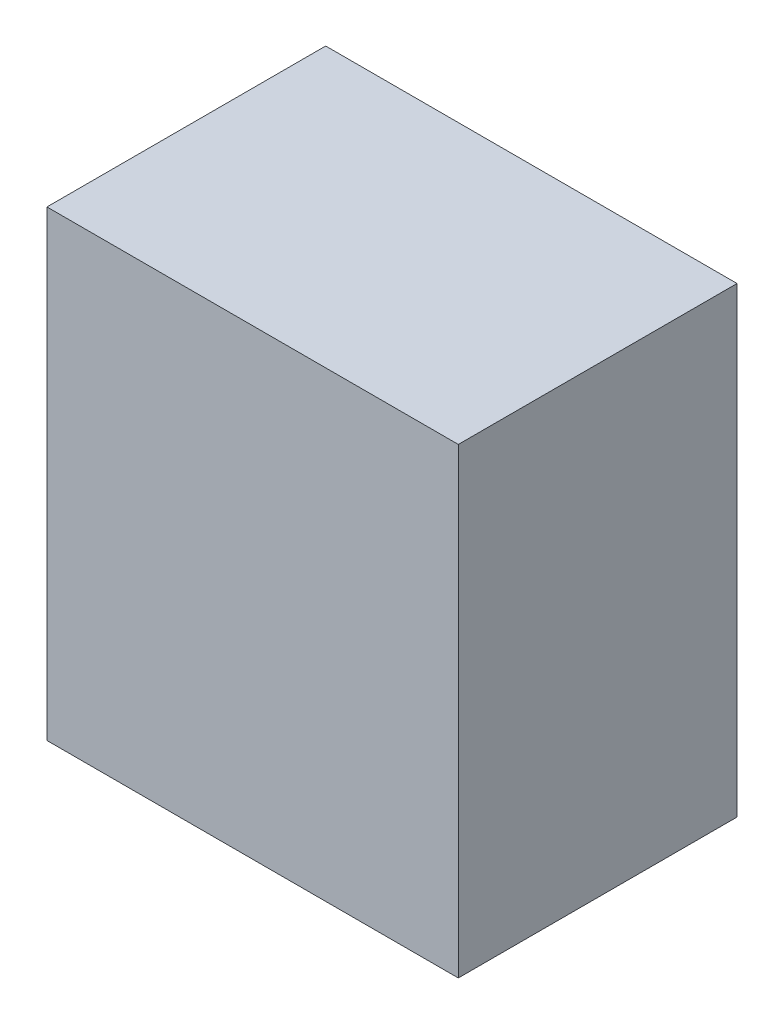
ISO-10303-21;
HEADER;
FILE_DESCRIPTION(('STEP AP214'),'2;1');
FILE_NAME('part.step','',(''),(''),'','','');
FILE_SCHEMA(('AUTOMOTIVE_DESIGN { 1 0 10303 214 1 1 1 1 }'));
ENDSEC;
DATA;
#1=APPLICATION_CONTEXT('core data for automotive mechanical design processes');
#2=APPLICATION_PROTOCOL_DEFINITION('international standard','automotive_design',2000,#1);
#3=PRODUCT_CONTEXT('',#1,'mechanical');
#4=PRODUCT('Part','Part','',(#3));
#5=PRODUCT_RELATED_PRODUCT_CATEGORY('part','',(#4));
#6=PRODUCT_DEFINITION_FORMATION('','',#4);
#7=PRODUCT_DEFINITION_CONTEXT('part definition',#1,'design');
#8=PRODUCT_DEFINITION('design','',#6,#7);
#9=PRODUCT_DEFINITION_SHAPE('','',#8);
#10=(LENGTH_UNIT() NAMED_UNIT(*) SI_UNIT(.MILLI.,.METRE.));
#11=(NAMED_UNIT(*) PLANE_ANGLE_UNIT() SI_UNIT($,.RADIAN.));
#12=(NAMED_UNIT(*) SI_UNIT($,.STERADIAN.) SOLID_ANGLE_UNIT());
#13=UNCERTAINTY_MEASURE_WITH_UNIT(LENGTH_MEASURE(1.E-05),#10,'distance_accuracy_value','');
#14=(GEOMETRIC_REPRESENTATION_CONTEXT(3) GLOBAL_UNCERTAINTY_ASSIGNED_CONTEXT((#13)) GLOBAL_UNIT_ASSIGNED_CONTEXT((#10,
#11,#12)) REPRESENTATION_CONTEXT('',''));
#15=CARTESIAN_POINT('',(0.,0.,0.));
#16=DIRECTION('',(0.,0.,1.));
#17=DIRECTION('',(1.,0.,0.));
#18=AXIS2_PLACEMENT_3D('',#15,#16,#17);
#19=CARTESIAN_POINT('',(-3.04,-3.415,0.));
#20=DIRECTION('',(0.,0.,1.));
#21=DIRECTION('',(1.,0.,0.));
#22=AXIS2_PLACEMENT_3D('',#19,#20,#21);
#23=PLANE('',#22);
#24=DIRECTION('',(0.,-1.,0.));
#25=VECTOR('',#24,1.);
#26=CARTESIAN_POINT('',(-3.04000000000003,3.41500000000001,0.));
#27=LINE('',#26,#25);
#28=CARTESIAN_POINT('',(-3.04000000000003,3.41500000000001,0.));
#29=VERTEX_POINT('',#28);
#30=CARTESIAN_POINT('',(-3.04,-3.415,0.));
#31=VERTEX_POINT('',#30);
#32=EDGE_CURVE('E102',#29,#31,#27,.T.);
#33=ORIENTED_EDGE('',*,*,#32,.F.);
#34=DIRECTION('',(-1.,0.,0.));
#35=VECTOR('',#34,1.);
#36=CARTESIAN_POINT('',(-3.04000000000003,3.41500000000001,0.));
#37=LINE('',#36,#35);
#38=CARTESIAN_POINT('',(3.04,3.41499999999999,0.));
#39=VERTEX_POINT('',#38);
#40=EDGE_CURVE('E75',#39,#29,#37,.T.);
#41=ORIENTED_EDGE('',*,*,#40,.F.);
#42=DIRECTION('',(0.,1.,0.));
#43=VECTOR('',#42,1.);
#44=CARTESIAN_POINT('',(3.04,3.41499999999999,0.));
#45=LINE('',#44,#43);
#46=CARTESIAN_POINT('',(3.04000000000004,-3.41500000000001,0.));
#47=VERTEX_POINT('',#46);
#48=EDGE_CURVE('E69',#47,#39,#45,.T.);
#49=ORIENTED_EDGE('',*,*,#48,.F.);
#50=DIRECTION('',(1.,0.,0.));
#51=VECTOR('',#50,1.);
#52=CARTESIAN_POINT('',(-3.04,-3.415,0.));
#53=LINE('',#52,#51);
#54=EDGE_CURVE('E93',#31,#47,#53,.T.);
#55=ORIENTED_EDGE('',*,*,#54,.F.);
#56=EDGE_LOOP('',(#33,#41,#49,#55));
#57=FACE_BOUND('',#56,.T.);
#58=CARTESIAN_POINT('',(0.,0.565000000000003,0.));
#59=DIRECTION('',(0.,0.,1.));
#60=DIRECTION('',(1.,0.,0.));
#61=AXIS2_PLACEMENT_3D('',#58,#59,#60);
#62=CIRCLE('',#61,2.35);
#63=CARTESIAN_POINT('',(2.35,0.565000000000003,0.));
#64=VERTEX_POINT('',#63);
#65=EDGE_CURVE('E11',#64,#64,#62,.F.);
#66=ORIENTED_EDGE('',*,*,#65,.F.);
#67=EDGE_LOOP('',(#66));
#68=FACE_BOUND('',#67,.T.);
#69=ADVANCED_FACE('F34',(#57,#68),#23,.F.);
#70=CARTESIAN_POINT('',(-3.04000000000004,3.41499999999998,4.12));
#71=DIRECTION('',(1.,0.,0.));
#72=DIRECTION('',(0.,0.,-1.));
#73=AXIS2_PLACEMENT_3D('',#70,#71,#72);
#74=PLANE('',#73);
#75=ORIENTED_EDGE('',*,*,#32,.T.);
#76=DIRECTION('',(0.,0.,-1.));
#77=VECTOR('',#76,1.);
#78=CARTESIAN_POINT('',(-3.04000000000007,-3.41500000000002,4.12));
#79=LINE('',#78,#77);
#80=CARTESIAN_POINT('',(-3.04000000000007,-3.41500000000002,4.12));
#81=VERTEX_POINT('',#80);
#82=EDGE_CURVE('E44',#81,#31,#79,.T.);
#83=ORIENTED_EDGE('',*,*,#82,.F.);
#84=DIRECTION('',(0.,-1.,0.));
#85=VECTOR('',#84,1.);
#86=CARTESIAN_POINT('',(-3.04000000000004,3.41499999999998,4.12));
#87=LINE('',#86,#85);
#88=CARTESIAN_POINT('',(-3.04000000000004,3.41499999999998,4.12));
#89=VERTEX_POINT('',#88);
#90=EDGE_CURVE('E88',#89,#81,#87,.T.);
#91=ORIENTED_EDGE('',*,*,#90,.F.);
#92=DIRECTION('',(0.,0.,-1.));
#93=VECTOR('',#92,1.);
#94=CARTESIAN_POINT('',(-3.04000000000004,3.41499999999998,4.12));
#95=LINE('',#94,#93);
#96=EDGE_CURVE('E98',#89,#29,#95,.T.);
#97=ORIENTED_EDGE('',*,*,#96,.T.);
#98=EDGE_LOOP('',(#75,#83,#91,#97));
#99=FACE_BOUND('',#98,.T.);
#100=ADVANCED_FACE('F112',(#99),#74,.F.);
#101=CARTESIAN_POINT('',(-3.04000000000007,-3.41500000000002,4.12));
#102=DIRECTION('',(0.,1.,0.));
#103=DIRECTION('',(0.,0.,1.));
#104=AXIS2_PLACEMENT_3D('',#101,#102,#103);
#105=PLANE('',#104);
#106=ORIENTED_EDGE('',*,*,#54,.T.);
#107=DIRECTION('',(0.,0.,-1.));
#108=VECTOR('',#107,1.);
#109=CARTESIAN_POINT('',(3.03999999999999,-3.41500000000002,4.12));
#110=LINE('',#109,#108);
#111=CARTESIAN_POINT('',(3.03999999999999,-3.41500000000002,4.12));
#112=VERTEX_POINT('',#111);
#113=EDGE_CURVE('E91',#112,#47,#110,.T.);
#114=ORIENTED_EDGE('',*,*,#113,.F.);
#115=DIRECTION('',(1.,0.,0.));
#116=VECTOR('',#115,1.);
#117=CARTESIAN_POINT('',(-3.04000000000007,-3.41500000000002,4.12));
#118=LINE('',#117,#116);
#119=EDGE_CURVE('E83',#81,#112,#118,.T.);
#120=ORIENTED_EDGE('',*,*,#119,.F.);
#121=ORIENTED_EDGE('',*,*,#82,.T.);
#122=EDGE_LOOP('',(#106,#114,#120,#121));
#123=FACE_BOUND('',#122,.T.);
#124=ADVANCED_FACE('F92',(#123),#105,.F.);
#125=CARTESIAN_POINT('',(3.04,3.41499999999998,4.12));
#126=DIRECTION('',(-1.,0.,0.));
#127=DIRECTION('',(0.,0.,1.));
#128=AXIS2_PLACEMENT_3D('',#125,#126,#127);
#129=PLANE('',#128);
#130=ORIENTED_EDGE('',*,*,#48,.T.);
#131=DIRECTION('',(0.,0.,-1.));
#132=VECTOR('',#131,1.);
#133=CARTESIAN_POINT('',(3.04,3.41499999999998,4.12));
#134=LINE('',#133,#132);
#135=CARTESIAN_POINT('',(3.04,3.41499999999998,4.12));
#136=VERTEX_POINT('',#135);
#137=EDGE_CURVE('E94',#136,#39,#134,.T.);
#138=ORIENTED_EDGE('',*,*,#137,.F.);
#139=DIRECTION('',(0.,1.,0.));
#140=VECTOR('',#139,1.);
#141=CARTESIAN_POINT('',(3.04,3.41499999999998,4.12));
#142=LINE('',#141,#140);
#143=EDGE_CURVE('E86',#112,#136,#142,.T.);
#144=ORIENTED_EDGE('',*,*,#143,.F.);
#145=ORIENTED_EDGE('',*,*,#113,.T.);
#146=EDGE_LOOP('',(#130,#138,#144,#145));
#147=FACE_BOUND('',#146,.T.);
#148=ADVANCED_FACE('F96',(#147),#129,.F.);
#149=CARTESIAN_POINT('',(-3.04000000000004,3.41499999999998,4.12));
#150=DIRECTION('',(0.,-1.,0.));
#151=DIRECTION('',(0.,0.,-1.));
#152=AXIS2_PLACEMENT_3D('',#149,#150,#151);
#153=PLANE('',#152);
#154=ORIENTED_EDGE('',*,*,#40,.T.);
#155=ORIENTED_EDGE('',*,*,#96,.F.);
#156=DIRECTION('',(-1.,0.,0.));
#157=VECTOR('',#156,1.);
#158=CARTESIAN_POINT('',(-3.04000000000004,3.41499999999998,4.12));
#159=LINE('',#158,#157);
#160=EDGE_CURVE('E52',#136,#89,#159,.T.);
#161=ORIENTED_EDGE('',*,*,#160,.F.);
#162=ORIENTED_EDGE('',*,*,#137,.T.);
#163=EDGE_LOOP('',(#154,#155,#161,#162));
#164=FACE_BOUND('',#163,.T.);
#165=ADVANCED_FACE('F128',(#164),#153,.F.);
#166=CARTESIAN_POINT('',(-3.04000000000007,-3.41500000000002,4.12));
#167=DIRECTION('',(0.,0.,1.));
#168=DIRECTION('',(1.,0.,0.));
#169=AXIS2_PLACEMENT_3D('',#166,#167,#168);
#170=PLANE('',#169);
#171=ORIENTED_EDGE('',*,*,#90,.T.);
#172=ORIENTED_EDGE('',*,*,#119,.T.);
#173=ORIENTED_EDGE('',*,*,#143,.T.);
#174=ORIENTED_EDGE('',*,*,#160,.T.);
#175=EDGE_LOOP('',(#171,#172,#173,#174));
#176=FACE_BOUND('',#175,.T.);
#177=ADVANCED_FACE('F84',(#176),#170,.T.);
#178=CARTESIAN_POINT('',(0.,0.565000000000003,-0.0999999999999994));
#179=DIRECTION('',(0.,0.,1.));
#180=DIRECTION('',(1.,0.,0.));
#181=AXIS2_PLACEMENT_3D('',#178,#179,#180);
#182=CYLINDRICAL_SURFACE('',#181,2.35);
#183=CARTESIAN_POINT('',(0.,0.565000000000003,-0.0999999999999994));
#184=DIRECTION('',(0.,0.,-1.));
#185=DIRECTION('',(-1.,0.,0.));
#186=AXIS2_PLACEMENT_3D('',#183,#184,#185);
#187=CIRCLE('',#186,2.35);
#188=CARTESIAN_POINT('',(-2.35,0.565000000000003,-0.0999999999999994));
#189=VERTEX_POINT('',#188);
#190=EDGE_CURVE('E38',#189,#189,#187,.T.);
#191=ORIENTED_EDGE('',*,*,#190,.F.);
#192=EDGE_LOOP('',(#191));
#193=FACE_BOUND('',#192,.T.);
#194=ORIENTED_EDGE('',*,*,#65,.T.);
#195=EDGE_LOOP('',(#194));
#196=FACE_BOUND('',#195,.T.);
#197=ADVANCED_FACE('F119',(#193,#196),#182,.T.);
#198=CARTESIAN_POINT('',(0.,0.565000000000003,1.07931034482759));
#199=DIRECTION('',(0.,0.,1.));
#200=DIRECTION('',(1.,0.,0.));
#201=AXIS2_PLACEMENT_3D('',#198,#199,#200);
#202=SPHERICAL_SURFACE('',#201,2.62931034482759);
#203=ORIENTED_EDGE('',*,*,#190,.T.);
#204=EDGE_LOOP('',(#203));
#205=FACE_BOUND('',#204,.T.);
#206=ADVANCED_FACE('F36',(#205),#202,.T.);
#207=CLOSED_SHELL('',(#69,#100,#124,#148,#165,#177,#197,#206));
#208=MANIFOLD_SOLID_BREP('B2',#207);
#209=ADVANCED_BREP_SHAPE_REPRESENTATION('',(#18,#208),#14);
#210=SHAPE_DEFINITION_REPRESENTATION(#9,#209);
ENDSEC;
END-ISO-10303-21;
